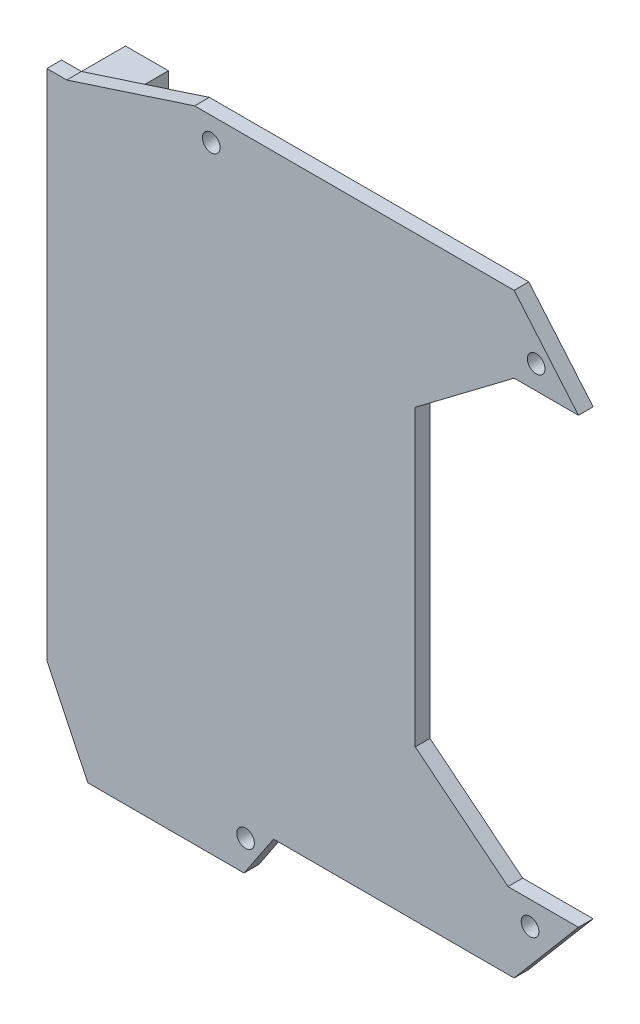
ISO-10303-21;
HEADER;
FILE_DESCRIPTION(('STEP AP214'),'2;1');
FILE_NAME('part.step','',(''),(''),'','','');
FILE_SCHEMA(('AUTOMOTIVE_DESIGN { 1 0 10303 214 1 1 1 1 }'));
ENDSEC;
DATA;
#1=APPLICATION_CONTEXT('core data for automotive mechanical design processes');
#2=APPLICATION_PROTOCOL_DEFINITION('international standard','automotive_design',2000,#1);
#3=PRODUCT_CONTEXT('',#1,'mechanical');
#4=PRODUCT('Part','Part','',(#3));
#5=PRODUCT_RELATED_PRODUCT_CATEGORY('part','',(#4));
#6=PRODUCT_DEFINITION_FORMATION('','',#4);
#7=PRODUCT_DEFINITION_CONTEXT('part definition',#1,'design');
#8=PRODUCT_DEFINITION('design','',#6,#7);
#9=PRODUCT_DEFINITION_SHAPE('','',#8);
#10=(LENGTH_UNIT() NAMED_UNIT(*) SI_UNIT(.MILLI.,.METRE.));
#11=(NAMED_UNIT(*) PLANE_ANGLE_UNIT() SI_UNIT($,.RADIAN.));
#12=(NAMED_UNIT(*) SI_UNIT($,.STERADIAN.) SOLID_ANGLE_UNIT());
#13=UNCERTAINTY_MEASURE_WITH_UNIT(LENGTH_MEASURE(1.E-05),#10,'distance_accuracy_value','');
#14=(GEOMETRIC_REPRESENTATION_CONTEXT(3) GLOBAL_UNCERTAINTY_ASSIGNED_CONTEXT((#13)) GLOBAL_UNIT_ASSIGNED_CONTEXT((#10,
#11,#12)) REPRESENTATION_CONTEXT('',''));
#15=CARTESIAN_POINT('',(0.,0.,0.));
#16=DIRECTION('',(0.,0.,1.));
#17=DIRECTION('',(1.,0.,0.));
#18=AXIS2_PLACEMENT_3D('',#15,#16,#17);
#19=CARTESIAN_POINT('',(0.,0.,0.));
#20=DIRECTION('',(0.,0.,1.));
#21=DIRECTION('',(1.,0.,0.));
#22=AXIS2_PLACEMENT_3D('',#19,#20,#21);
#23=PLANE('',#22);
#24=DIRECTION('',(1.,0.,0.));
#25=VECTOR('',#24,1.);
#26=CARTESIAN_POINT('',(3.09545141255474E-12,64.9999999999908,0.));
#27=LINE('',#26,#25);
#28=CARTESIAN_POINT('',(-165.299999999978,64.9999999999984,0.));
#29=VERTEX_POINT('',#28);
#30=CARTESIAN_POINT('',(-159.471717964454,64.9999999999984,0.));
#31=VERTEX_POINT('',#30);
#32=EDGE_CURVE('E218',#29,#31,#27,.T.);
#33=ORIENTED_EDGE('',*,*,#32,.F.);
#34=DIRECTION('',(-0.951114376083628,-0.308838863498509,0.));
#35=VECTOR('',#34,1.);
#36=CARTESIAN_POINT('',(-34.8597230210824,107.355607179939,0.));
#37=LINE('',#36,#35);
#38=CARTESIAN_POINT('',(-147.899999999978,70.65,0.));
#39=VERTEX_POINT('',#38);
#40=EDGE_CURVE('E310',#39,#29,#37,.T.);
#41=ORIENTED_EDGE('',*,*,#40,.F.);
#42=DIRECTION('',(-1.,0.,0.));
#43=VECTOR('',#42,1.);
#44=CARTESIAN_POINT('',(0.,70.65,0.));
#45=LINE('',#44,#43);
#46=CARTESIAN_POINT('',(-104.449999999978,70.65,0.));
#47=VERTEX_POINT('',#46);
#48=EDGE_CURVE('E308',#47,#39,#45,.T.);
#49=ORIENTED_EDGE('',*,*,#48,.F.);
#50=DIRECTION('',(-0.645611424246067,0.763666084675079,0.));
#51=VECTOR('',#50,1.);
#52=CARTESIAN_POINT('',(-26.0810871869541,-22.0492282982811,0.));
#53=LINE('',#52,#51);
#54=CARTESIAN_POINT('',(-95.6999999999259,60.3,0.));
#55=VERTEX_POINT('',#54);
#56=EDGE_CURVE('E306',#55,#47,#53,.T.);
#57=ORIENTED_EDGE('',*,*,#56,.F.);
#58=DIRECTION('',(1.,0.,0.));
#59=VECTOR('',#58,1.);
#60=CARTESIAN_POINT('',(0.,60.3000000000001,0.));
#61=LINE('',#60,#59);
#62=CARTESIAN_POINT('',(-104.449999999978,60.2999999999999,0.));
#63=VERTEX_POINT('',#62);
#64=EDGE_CURVE('E304',#63,#55,#61,.T.);
#65=ORIENTED_EDGE('',*,*,#64,.F.);
#66=DIRECTION('',(-0.798128725131587,-0.602486960954201,0.));
#67=VECTOR('',#66,1.);
#68=CARTESIAN_POINT('',(-66.9103493549113,88.6377221245856,0.));
#69=LINE('',#68,#67);
#70=CARTESIAN_POINT('',(-117.895945032972,50.15,0.));
#71=VERTEX_POINT('',#70);
#72=EDGE_CURVE('E254',#63,#71,#69,.T.);
#73=ORIENTED_EDGE('',*,*,#72,.T.);
#74=DIRECTION('',(0.,1.,0.));
#75=VECTOR('',#74,1.);
#76=CARTESIAN_POINT('',(-117.895945032972,0.,0.));
#77=LINE('',#76,#75);
#78=CARTESIAN_POINT('',(-117.895945032972,10.15,0.));
#79=VERTEX_POINT('',#78);
#80=EDGE_CURVE('E333',#79,#71,#77,.T.);
#81=ORIENTED_EDGE('',*,*,#80,.F.);
#82=DIRECTION('',(0.779012340572827,-0.627008591037831,0.));
#83=VECTOR('',#82,1.);
#84=CARTESIAN_POINT('',(-41.3918436804715,-51.4263400646183,0.));
#85=LINE('',#84,#83);
#86=CARTESIAN_POINT('',(-105.28531198929,0.,0.));
#87=VERTEX_POINT('',#86);
#88=EDGE_CURVE('E330',#79,#87,#85,.T.);
#89=ORIENTED_EDGE('',*,*,#88,.T.);
#90=DIRECTION('',(-1.,0.,0.));
#91=VECTOR('',#90,1.);
#92=CARTESIAN_POINT('',(0.,3.44548704045019E-12,0.));
#93=LINE('',#92,#91);
#94=CARTESIAN_POINT('',(-95.6999999999782,3.19189119579733E-13,0.));
#95=VERTEX_POINT('',#94);
#96=EDGE_CURVE('E327',#95,#87,#93,.T.);
#97=ORIENTED_EDGE('',*,*,#96,.F.);
#98=DIRECTION('',(0.645611424243821,0.763666084676978,0.));
#99=VECTOR('',#98,1.);
#100=CARTESIAN_POINT('',(-55.8108895663648,47.1831191986174,0.));
#101=LINE('',#100,#99);
#102=CARTESIAN_POINT('',(-104.449999999978,-10.35,0.));
#103=VERTEX_POINT('',#102);
#104=EDGE_CURVE('E325',#103,#95,#101,.T.);
#105=ORIENTED_EDGE('',*,*,#104,.F.);
#106=DIRECTION('',(1.,0.,0.));
#107=VECTOR('',#106,1.);
#108=CARTESIAN_POINT('',(0.,-10.35,0.));
#109=LINE('',#108,#107);
#110=CARTESIAN_POINT('',(-137.174369577049,-10.35,0.));
#111=VERTEX_POINT('',#110);
#112=EDGE_CURVE('E323',#111,#103,#109,.T.);
#113=ORIENTED_EDGE('',*,*,#112,.F.);
#114=DIRECTION('',(0.554700196225229,0.832050294337843,0.));
#115=VECTOR('',#114,1.);
#116=CARTESIAN_POINT('',(-90.189948168726,60.126632112484,0.));
#117=LINE('',#116,#115);
#118=CARTESIAN_POINT('',(-141.174369577049,-16.35,0.));
#119=VERTEX_POINT('',#118);
#120=EDGE_CURVE('E321',#119,#111,#117,.T.);
#121=ORIENTED_EDGE('',*,*,#120,.F.);
#122=DIRECTION('',(1.,0.,0.));
#123=VECTOR('',#122,1.);
#124=CARTESIAN_POINT('',(0.,-16.35,0.));
#125=LINE('',#124,#123);
#126=CARTESIAN_POINT('',(-162.432743362809,-16.35,0.));
#127=VERTEX_POINT('',#126);
#128=EDGE_CURVE('E319',#127,#119,#125,.T.);
#129=ORIENTED_EDGE('',*,*,#128,.F.);
#130=DIRECTION('',(0.43117294116868,-0.902269302815933,0.));
#131=VECTOR('',#130,1.);
#132=CARTESIAN_POINT('',(-138.595562639446,-66.2315078100012,0.));
#133=LINE('',#132,#131);
#134=CARTESIAN_POINT('',(-167.999999999978,-4.69999999999982,0.));
#135=VERTEX_POINT('',#134);
#136=EDGE_CURVE('E317',#135,#127,#133,.T.);
#137=ORIENTED_EDGE('',*,*,#136,.F.);
#138=DIRECTION('',(0.,-1.,0.));
#139=VECTOR('',#138,1.);
#140=CARTESIAN_POINT('',(-167.999999999978,-1.00350144263095E-12,0.));
#141=LINE('',#140,#139);
#142=CARTESIAN_POINT('',(-167.999999999978,64.9999999999984,0.));
#143=VERTEX_POINT('',#142);
#144=EDGE_CURVE('E315',#143,#135,#141,.T.);
#145=ORIENTED_EDGE('',*,*,#144,.F.);
#146=DIRECTION('',(1.,0.,0.));
#147=VECTOR('',#146,1.);
#148=CARTESIAN_POINT('',(0.,64.9999999999984,0.));
#149=LINE('',#148,#147);
#150=EDGE_CURVE('E313',#143,#29,#149,.T.);
#151=ORIENTED_EDGE('',*,*,#150,.T.);
#152=DIRECTION('',(0.,-1.,0.));
#153=VECTOR('',#152,1.);
#154=CARTESIAN_POINT('',(-165.299999999978,-7.63278329429795E-13,0.));
#155=LINE('',#154,#153);
#156=CARTESIAN_POINT('',(-165.299999999978,59.0000000000005,0.));
#157=VERTEX_POINT('',#156);
#158=EDGE_CURVE('E64',#29,#157,#155,.T.);
#159=ORIENTED_EDGE('',*,*,#158,.T.);
#160=DIRECTION('',(1.,0.,0.));
#161=VECTOR('',#160,1.);
#162=CARTESIAN_POINT('',(1.99005308759714E-13,59.,0.));
#163=LINE('',#162,#161);
#164=CARTESIAN_POINT('',(-159.471717964454,59.0000000000005,0.));
#165=VERTEX_POINT('',#164);
#166=EDGE_CURVE('E241',#157,#165,#163,.T.);
#167=ORIENTED_EDGE('',*,*,#166,.T.);
#168=DIRECTION('',(0.,-1.,0.));
#169=VECTOR('',#168,1.);
#170=CARTESIAN_POINT('',(-159.471717964454,0.,0.));
#171=LINE('',#170,#169);
#172=EDGE_CURVE('E221',#31,#165,#171,.T.);
#173=ORIENTED_EDGE('',*,*,#172,.F.);
#174=EDGE_LOOP('',(#33,#41,#49,#57,#65,#73,#81,#89,#97,#105,#113,#121,#129,#137,#145,#151,#159,
#167,#173));
#175=FACE_BOUND('',#174,.T.);
#176=CARTESIAN_POINT('',(-140.974369577049,-12.15,0.));
#177=DIRECTION('',(0.,0.,1.));
#178=DIRECTION('',(1.,0.,0.));
#179=AXIS2_PLACEMENT_3D('',#176,#177,#178);
#180=CIRCLE('',#179,1.19999999999996);
#181=CARTESIAN_POINT('',(-139.774369577049,-12.15,0.));
#182=VERTEX_POINT('',#181);
#183=EDGE_CURVE('E336',#182,#182,#180,.T.);
#184=ORIENTED_EDGE('',*,*,#183,.T.);
#185=EDGE_LOOP('',(#184));
#186=FACE_BOUND('',#185,.T.);
#187=CARTESIAN_POINT('',(-102.28531198929,-3.20000000000016,0.));
#188=DIRECTION('',(0.,0.,1.));
#189=DIRECTION('',(1.,0.,0.));
#190=AXIS2_PLACEMENT_3D('',#187,#188,#189);
#191=CIRCLE('',#190,1.19999999999837);
#192=CARTESIAN_POINT('',(-101.085311989291,-3.20000000000016,0.));
#193=VERTEX_POINT('',#192);
#194=EDGE_CURVE('E339',#193,#193,#191,.T.);
#195=ORIENTED_EDGE('',*,*,#194,.T.);
#196=EDGE_LOOP('',(#195));
#197=FACE_BOUND('',#196,.T.);
#198=CARTESIAN_POINT('',(-101.449999999978,63.5,0.));
#199=DIRECTION('',(0.,0.,1.));
#200=DIRECTION('',(1.,0.,0.));
#201=AXIS2_PLACEMENT_3D('',#198,#199,#200);
#202=CIRCLE('',#201,1.2);
#203=CARTESIAN_POINT('',(-100.249999999978,63.5,0.));
#204=VERTEX_POINT('',#203);
#205=EDGE_CURVE('E342',#204,#204,#202,.T.);
#206=ORIENTED_EDGE('',*,*,#205,.T.);
#207=EDGE_LOOP('',(#206));
#208=FACE_BOUND('',#207,.T.);
#209=CARTESIAN_POINT('',(-145.642132300022,67.45,0.));
#210=DIRECTION('',(0.,0.,1.));
#211=DIRECTION('',(1.,0.,0.));
#212=AXIS2_PLACEMENT_3D('',#209,#210,#211);
#213=CIRCLE('',#212,1.20000000000002);
#214=CARTESIAN_POINT('',(-144.442132300022,67.45,0.));
#215=VERTEX_POINT('',#214);
#216=EDGE_CURVE('E259',#215,#215,#213,.T.);
#217=ORIENTED_EDGE('',*,*,#216,.T.);
#218=EDGE_LOOP('',(#217));
#219=FACE_BOUND('',#218,.T.);
#220=DIRECTION('',(1.,0.,0.));
#221=VECTOR('',#220,1.);
#222=CARTESIAN_POINT('',(0.,1.30000000000023,-1.346145417358E-12));
#223=LINE('',#222,#221);
#224=CARTESIAN_POINT('',(-165.299999999978,1.30000000000052,0.));
#225=VERTEX_POINT('',#224);
#226=CARTESIAN_POINT('',(-159.471717964454,1.30000000000051,0.));
#227=VERTEX_POINT('',#226);
#228=EDGE_CURVE('E216',#225,#227,#223,.T.);
#229=ORIENTED_EDGE('',*,*,#228,.F.);
#230=DIRECTION('',(0.,-1.,0.));
#231=VECTOR('',#230,1.);
#232=CARTESIAN_POINT('',(-165.299999999978,-2.29677388219329E-12,1.346145417358E-12));
#233=LINE('',#232,#231);
#234=CARTESIAN_POINT('',(-165.299999999978,-4.69999999999948,0.));
#235=VERTEX_POINT('',#234);
#236=EDGE_CURVE('E212',#225,#235,#233,.T.);
#237=ORIENTED_EDGE('',*,*,#236,.T.);
#238=DIRECTION('',(1.,0.,0.));
#239=VECTOR('',#238,1.);
#240=CARTESIAN_POINT('',(-2.1822279226702E-13,-4.70000000000714,-1.346145417358E-12));
#241=LINE('',#240,#239);
#242=CARTESIAN_POINT('',(-159.471717964454,-4.69999999999973,0.));
#243=VERTEX_POINT('',#242);
#244=EDGE_CURVE('E56',#235,#243,#241,.T.);
#245=ORIENTED_EDGE('',*,*,#244,.T.);
#246=DIRECTION('',(0.,-1.,0.));
#247=VECTOR('',#246,1.);
#248=CARTESIAN_POINT('',(-159.471717964454,0.,1.346145417358E-12));
#249=LINE('',#248,#247);
#250=EDGE_CURVE('E860',#227,#243,#249,.T.);
#251=ORIENTED_EDGE('',*,*,#250,.F.);
#252=EDGE_LOOP('',(#229,#237,#245,#251));
#253=FACE_BOUND('',#252,.T.);
#254=ADVANCED_FACE('F41',(#175,#186,#197,#208,#219,#253),#23,.F.);
#255=CARTESIAN_POINT('',(-66.9103493549113,88.6377221245856,2.));
#256=DIRECTION('',(0.602486960954201,-0.798128725131587,0.));
#257=DIRECTION('',(0.798128725131587,0.602486960954201,0.));
#258=AXIS2_PLACEMENT_3D('',#255,#256,#257);
#259=PLANE('',#258);
#260=ORIENTED_EDGE('',*,*,#72,.F.);
#261=DIRECTION('',(0.,0.,-1.));
#262=VECTOR('',#261,1.);
#263=CARTESIAN_POINT('',(-104.449999999978,60.2999999999999,2.));
#264=LINE('',#263,#262);
#265=CARTESIAN_POINT('',(-104.449999999978,60.2999999999999,2.));
#266=VERTEX_POINT('',#265);
#267=EDGE_CURVE('E11',#266,#63,#264,.T.);
#268=ORIENTED_EDGE('',*,*,#267,.F.);
#269=DIRECTION('',(-0.798128725131587,-0.602486960954201,0.));
#270=VECTOR('',#269,1.);
#271=CARTESIAN_POINT('',(-66.9103493549113,88.6377221245856,2.));
#272=LINE('',#271,#270);
#273=CARTESIAN_POINT('',(-117.895945032972,50.15,2.));
#274=VERTEX_POINT('',#273);
#275=EDGE_CURVE('E255',#266,#274,#272,.T.);
#276=ORIENTED_EDGE('',*,*,#275,.T.);
#277=DIRECTION('',(0.,0.,-1.));
#278=VECTOR('',#277,1.);
#279=CARTESIAN_POINT('',(-117.895945032972,50.15,2.));
#280=LINE('',#279,#278);
#281=EDGE_CURVE('E301',#274,#71,#280,.T.);
#282=ORIENTED_EDGE('',*,*,#281,.T.);
#283=EDGE_LOOP('',(#260,#268,#276,#282));
#284=FACE_BOUND('',#283,.T.);
#285=ADVANCED_FACE('F43',(#284),#259,.T.);
#286=CARTESIAN_POINT('',(0.,60.3000000000001,2.));
#287=DIRECTION('',(0.,1.,0.));
#288=DIRECTION('',(-1.,0.,0.));
#289=AXIS2_PLACEMENT_3D('',#286,#287,#288);
#290=PLANE('',#289);
#291=ORIENTED_EDGE('',*,*,#64,.T.);
#292=DIRECTION('',(0.,0.,-1.));
#293=VECTOR('',#292,1.);
#294=CARTESIAN_POINT('',(-95.6999999999259,60.3,2.));
#295=LINE('',#294,#293);
#296=CARTESIAN_POINT('',(-95.6999999999259,60.3,2.));
#297=VERTEX_POINT('',#296);
#298=EDGE_CURVE('E49',#297,#55,#295,.T.);
#299=ORIENTED_EDGE('',*,*,#298,.F.);
#300=DIRECTION('',(1.,0.,0.));
#301=VECTOR('',#300,1.);
#302=CARTESIAN_POINT('',(0.,60.3000000000001,2.));
#303=LINE('',#302,#301);
#304=EDGE_CURVE('E258',#266,#297,#303,.T.);
#305=ORIENTED_EDGE('',*,*,#304,.F.);
#306=ORIENTED_EDGE('',*,*,#267,.T.);
#307=EDGE_LOOP('',(#291,#299,#305,#306));
#308=FACE_BOUND('',#307,.T.);
#309=ADVANCED_FACE('F407',(#308),#290,.F.);
#310=CARTESIAN_POINT('',(-26.0810871869541,-22.0492282982811,2.));
#311=DIRECTION('',(-0.763666084675079,-0.645611424246067,0.));
#312=DIRECTION('',(0.645611424246067,-0.763666084675079,0.));
#313=AXIS2_PLACEMENT_3D('',#310,#311,#312);
#314=PLANE('',#313);
#315=ORIENTED_EDGE('',*,*,#56,.T.);
#316=DIRECTION('',(0.,0.,-1.));
#317=VECTOR('',#316,1.);
#318=CARTESIAN_POINT('',(-104.449999999978,70.65,2.));
#319=LINE('',#318,#317);
#320=CARTESIAN_POINT('',(-104.449999999978,70.65,2.));
#321=VERTEX_POINT('',#320);
#322=EDGE_CURVE('E378',#321,#47,#319,.T.);
#323=ORIENTED_EDGE('',*,*,#322,.F.);
#324=DIRECTION('',(-0.645611424246067,0.763666084675079,0.));
#325=VECTOR('',#324,1.);
#326=CARTESIAN_POINT('',(-26.0810871869541,-22.0492282982811,2.));
#327=LINE('',#326,#325);
#328=EDGE_CURVE('E261',#297,#321,#327,.T.);
#329=ORIENTED_EDGE('',*,*,#328,.F.);
#330=ORIENTED_EDGE('',*,*,#298,.T.);
#331=EDGE_LOOP('',(#315,#323,#329,#330));
#332=FACE_BOUND('',#331,.T.);
#333=ADVANCED_FACE('F385',(#332),#314,.F.);
#334=CARTESIAN_POINT('',(0.,70.65,2.));
#335=DIRECTION('',(0.,-1.,0.));
#336=DIRECTION('',(0.,0.,-1.));
#337=AXIS2_PLACEMENT_3D('',#334,#335,#336);
#338=PLANE('',#337);
#339=ORIENTED_EDGE('',*,*,#48,.T.);
#340=DIRECTION('',(0.,0.,-1.));
#341=VECTOR('',#340,1.);
#342=CARTESIAN_POINT('',(-147.899999999978,70.65,2.));
#343=LINE('',#342,#341);
#344=CARTESIAN_POINT('',(-147.899999999978,70.65,2.));
#345=VERTEX_POINT('',#344);
#346=EDGE_CURVE('E375',#345,#39,#343,.T.);
#347=ORIENTED_EDGE('',*,*,#346,.F.);
#348=DIRECTION('',(-1.,0.,0.));
#349=VECTOR('',#348,1.);
#350=CARTESIAN_POINT('',(0.,70.65,2.));
#351=LINE('',#350,#349);
#352=EDGE_CURVE('E263',#321,#345,#351,.T.);
#353=ORIENTED_EDGE('',*,*,#352,.F.);
#354=ORIENTED_EDGE('',*,*,#322,.T.);
#355=EDGE_LOOP('',(#339,#347,#353,#354));
#356=FACE_BOUND('',#355,.T.);
#357=ADVANCED_FACE('F396',(#356),#338,.F.);
#358=CARTESIAN_POINT('',(-34.8597230210824,107.355607179939,2.));
#359=DIRECTION('',(0.308838863498509,-0.951114376083628,0.));
#360=DIRECTION('',(0.951114376083628,0.308838863498509,0.));
#361=AXIS2_PLACEMENT_3D('',#358,#359,#360);
#362=PLANE('',#361);
#363=ORIENTED_EDGE('',*,*,#40,.T.);
#364=DIRECTION('',(0.,0.,-1.));
#365=VECTOR('',#364,1.);
#366=CARTESIAN_POINT('',(-165.299999999978,64.9999999999984,2.));
#367=LINE('',#366,#365);
#368=CARTESIAN_POINT('',(-165.299999999978,64.9999999999984,2.));
#369=VERTEX_POINT('',#368);
#370=EDGE_CURVE('E372',#369,#29,#367,.T.);
#371=ORIENTED_EDGE('',*,*,#370,.F.);
#372=DIRECTION('',(-0.951114376083628,-0.308838863498509,0.));
#373=VECTOR('',#372,1.);
#374=CARTESIAN_POINT('',(-34.8597230210824,107.355607179939,2.));
#375=LINE('',#374,#373);
#376=EDGE_CURVE('E265',#345,#369,#375,.T.);
#377=ORIENTED_EDGE('',*,*,#376,.F.);
#378=ORIENTED_EDGE('',*,*,#346,.T.);
#379=EDGE_LOOP('',(#363,#371,#377,#378));
#380=FACE_BOUND('',#379,.T.);
#381=ADVANCED_FACE('F400',(#380),#362,.F.);
#382=CARTESIAN_POINT('',(0.,64.9999999999984,2.));
#383=DIRECTION('',(0.,1.,0.));
#384=DIRECTION('',(0.,0.,1.));
#385=AXIS2_PLACEMENT_3D('',#382,#383,#384);
#386=PLANE('',#385);
#387=ORIENTED_EDGE('',*,*,#150,.F.);
#388=DIRECTION('',(0.,0.,-1.));
#389=VECTOR('',#388,1.);
#390=CARTESIAN_POINT('',(-167.999999999978,64.9999999999984,2.));
#391=LINE('',#390,#389);
#392=CARTESIAN_POINT('',(-167.999999999978,64.9999999999984,2.));
#393=VERTEX_POINT('',#392);
#394=EDGE_CURVE('E370',#393,#143,#391,.T.);
#395=ORIENTED_EDGE('',*,*,#394,.F.);
#396=DIRECTION('',(1.,0.,0.));
#397=VECTOR('',#396,1.);
#398=CARTESIAN_POINT('',(0.,64.9999999999984,2.));
#399=LINE('',#398,#397);
#400=EDGE_CURVE('E267',#393,#369,#399,.T.);
#401=ORIENTED_EDGE('',*,*,#400,.T.);
#402=ORIENTED_EDGE('',*,*,#370,.T.);
#403=EDGE_LOOP('',(#387,#395,#401,#402));
#404=FACE_BOUND('',#403,.T.);
#405=ADVANCED_FACE('F454',(#404),#386,.T.);
#406=CARTESIAN_POINT('',(-167.999999999978,-1.00350144263095E-12,2.));
#407=DIRECTION('',(1.,0.,0.));
#408=DIRECTION('',(0.,1.,0.));
#409=AXIS2_PLACEMENT_3D('',#406,#407,#408);
#410=PLANE('',#409);
#411=ORIENTED_EDGE('',*,*,#144,.T.);
#412=DIRECTION('',(0.,0.,-1.));
#413=VECTOR('',#412,1.);
#414=CARTESIAN_POINT('',(-167.999999999978,-4.69999999999982,2.));
#415=LINE('',#414,#413);
#416=CARTESIAN_POINT('',(-167.999999999978,-4.69999999999982,2.));
#417=VERTEX_POINT('',#416);
#418=EDGE_CURVE('E367',#417,#135,#415,.T.);
#419=ORIENTED_EDGE('',*,*,#418,.F.);
#420=DIRECTION('',(0.,-1.,0.));
#421=VECTOR('',#420,1.);
#422=CARTESIAN_POINT('',(-167.999999999978,-1.00350144263095E-12,2.));
#423=LINE('',#422,#421);
#424=EDGE_CURVE('E270',#393,#417,#423,.T.);
#425=ORIENTED_EDGE('',*,*,#424,.F.);
#426=ORIENTED_EDGE('',*,*,#394,.T.);
#427=EDGE_LOOP('',(#411,#419,#425,#426));
#428=FACE_BOUND('',#427,.T.);
#429=ADVANCED_FACE('F451',(#428),#410,.F.);
#430=CARTESIAN_POINT('',(-138.595562639446,-66.2315078100012,2.));
#431=DIRECTION('',(0.902269302815933,0.43117294116868,0.));
#432=DIRECTION('',(-0.43117294116868,0.902269302815933,0.));
#433=AXIS2_PLACEMENT_3D('',#430,#431,#432);
#434=PLANE('',#433);
#435=ORIENTED_EDGE('',*,*,#136,.T.);
#436=DIRECTION('',(0.,0.,-1.));
#437=VECTOR('',#436,1.);
#438=CARTESIAN_POINT('',(-162.432743362809,-16.35,2.));
#439=LINE('',#438,#437);
#440=CARTESIAN_POINT('',(-162.432743362809,-16.35,2.));
#441=VERTEX_POINT('',#440);
#442=EDGE_CURVE('E364',#441,#127,#439,.T.);
#443=ORIENTED_EDGE('',*,*,#442,.F.);
#444=DIRECTION('',(0.43117294116868,-0.902269302815933,0.));
#445=VECTOR('',#444,1.);
#446=CARTESIAN_POINT('',(-138.595562639446,-66.2315078100012,2.));
#447=LINE('',#446,#445);
#448=EDGE_CURVE('E272',#417,#441,#447,.T.);
#449=ORIENTED_EDGE('',*,*,#448,.F.);
#450=ORIENTED_EDGE('',*,*,#418,.T.);
#451=EDGE_LOOP('',(#435,#443,#449,#450));
#452=FACE_BOUND('',#451,.T.);
#453=ADVANCED_FACE('F447',(#452),#434,.F.);
#454=CARTESIAN_POINT('',(0.,-16.35,2.));
#455=DIRECTION('',(0.,1.,0.));
#456=DIRECTION('',(0.,0.,1.));
#457=AXIS2_PLACEMENT_3D('',#454,#455,#456);
#458=PLANE('',#457);
#459=ORIENTED_EDGE('',*,*,#128,.T.);
#460=DIRECTION('',(0.,0.,-1.));
#461=VECTOR('',#460,1.);
#462=CARTESIAN_POINT('',(-141.174369577049,-16.35,2.));
#463=LINE('',#462,#461);
#464=CARTESIAN_POINT('',(-141.174369577049,-16.35,2.));
#465=VERTEX_POINT('',#464);
#466=EDGE_CURVE('E361',#465,#119,#463,.T.);
#467=ORIENTED_EDGE('',*,*,#466,.F.);
#468=DIRECTION('',(1.,0.,0.));
#469=VECTOR('',#468,1.);
#470=CARTESIAN_POINT('',(0.,-16.35,2.));
#471=LINE('',#470,#469);
#472=EDGE_CURVE('E274',#441,#465,#471,.T.);
#473=ORIENTED_EDGE('',*,*,#472,.F.);
#474=ORIENTED_EDGE('',*,*,#442,.T.);
#475=EDGE_LOOP('',(#459,#467,#473,#474));
#476=FACE_BOUND('',#475,.T.);
#477=ADVANCED_FACE('F442',(#476),#458,.F.);
#478=CARTESIAN_POINT('',(-90.189948168726,60.126632112484,2.));
#479=DIRECTION('',(-0.832050294337843,0.554700196225229,0.));
#480=DIRECTION('',(-0.554700196225229,-0.832050294337843,0.));
#481=AXIS2_PLACEMENT_3D('',#478,#479,#480);
#482=PLANE('',#481);
#483=ORIENTED_EDGE('',*,*,#120,.T.);
#484=DIRECTION('',(0.,0.,-1.));
#485=VECTOR('',#484,1.);
#486=CARTESIAN_POINT('',(-137.174369577049,-10.35,2.));
#487=LINE('',#486,#485);
#488=CARTESIAN_POINT('',(-137.174369577049,-10.35,2.));
#489=VERTEX_POINT('',#488);
#490=EDGE_CURVE('E358',#489,#111,#487,.T.);
#491=ORIENTED_EDGE('',*,*,#490,.F.);
#492=DIRECTION('',(0.554700196225229,0.832050294337843,0.));
#493=VECTOR('',#492,1.);
#494=CARTESIAN_POINT('',(-90.189948168726,60.126632112484,2.));
#495=LINE('',#494,#493);
#496=EDGE_CURVE('E276',#465,#489,#495,.T.);
#497=ORIENTED_EDGE('',*,*,#496,.F.);
#498=ORIENTED_EDGE('',*,*,#466,.T.);
#499=EDGE_LOOP('',(#483,#491,#497,#498));
#500=FACE_BOUND('',#499,.T.);
#501=ADVANCED_FACE('F436',(#500),#482,.F.);
#502=CARTESIAN_POINT('',(0.,-10.35,2.));
#503=DIRECTION('',(0.,1.,0.));
#504=DIRECTION('',(-1.,0.,0.));
#505=AXIS2_PLACEMENT_3D('',#502,#503,#504);
#506=PLANE('',#505);
#507=ORIENTED_EDGE('',*,*,#112,.T.);
#508=DIRECTION('',(0.,0.,-1.));
#509=VECTOR('',#508,1.);
#510=CARTESIAN_POINT('',(-104.449999999978,-10.35,2.));
#511=LINE('',#510,#509);
#512=CARTESIAN_POINT('',(-104.449999999978,-10.35,2.));
#513=VERTEX_POINT('',#512);
#514=EDGE_CURVE('E355',#513,#103,#511,.T.);
#515=ORIENTED_EDGE('',*,*,#514,.F.);
#516=DIRECTION('',(1.,0.,0.));
#517=VECTOR('',#516,1.);
#518=CARTESIAN_POINT('',(0.,-10.35,2.));
#519=LINE('',#518,#517);
#520=EDGE_CURVE('E278',#489,#513,#519,.T.);
#521=ORIENTED_EDGE('',*,*,#520,.F.);
#522=ORIENTED_EDGE('',*,*,#490,.T.);
#523=EDGE_LOOP('',(#507,#515,#521,#522));
#524=FACE_BOUND('',#523,.T.);
#525=ADVANCED_FACE('F432',(#524),#506,.F.);
#526=CARTESIAN_POINT('',(-55.8108895663648,47.1831191986174,2.));
#527=DIRECTION('',(-0.763666084676978,0.645611424243821,0.));
#528=DIRECTION('',(-0.645611424243821,-0.763666084676978,0.));
#529=AXIS2_PLACEMENT_3D('',#526,#527,#528);
#530=PLANE('',#529);
#531=ORIENTED_EDGE('',*,*,#104,.T.);
#532=DIRECTION('',(0.,0.,-1.));
#533=VECTOR('',#532,1.);
#534=CARTESIAN_POINT('',(-95.6999999999782,3.19189119579733E-13,2.));
#535=LINE('',#534,#533);
#536=CARTESIAN_POINT('',(-95.6999999999782,3.19189119579733E-13,2.));
#537=VERTEX_POINT('',#536);
#538=EDGE_CURVE('E352',#537,#95,#535,.T.);
#539=ORIENTED_EDGE('',*,*,#538,.F.);
#540=DIRECTION('',(0.645611424243821,0.763666084676978,0.));
#541=VECTOR('',#540,1.);
#542=CARTESIAN_POINT('',(-55.8108895663648,47.1831191986174,2.));
#543=LINE('',#542,#541);
#544=EDGE_CURVE('E280',#513,#537,#543,.T.);
#545=ORIENTED_EDGE('',*,*,#544,.F.);
#546=ORIENTED_EDGE('',*,*,#514,.T.);
#547=EDGE_LOOP('',(#531,#539,#545,#546));
#548=FACE_BOUND('',#547,.T.);
#549=ADVANCED_FACE('F427',(#548),#530,.F.);
#550=CARTESIAN_POINT('',(0.,3.44548704045019E-12,2.));
#551=DIRECTION('',(0.,-1.,0.));
#552=DIRECTION('',(1.,0.,0.));
#553=AXIS2_PLACEMENT_3D('',#550,#551,#552);
#554=PLANE('',#553);
#555=ORIENTED_EDGE('',*,*,#96,.T.);
#556=DIRECTION('',(0.,0.,-1.));
#557=VECTOR('',#556,1.);
#558=CARTESIAN_POINT('',(-105.28531198929,0.,2.));
#559=LINE('',#558,#557);
#560=CARTESIAN_POINT('',(-105.28531198929,0.,2.));
#561=VERTEX_POINT('',#560);
#562=EDGE_CURVE('E350',#561,#87,#559,.T.);
#563=ORIENTED_EDGE('',*,*,#562,.F.);
#564=DIRECTION('',(-1.,0.,0.));
#565=VECTOR('',#564,1.);
#566=CARTESIAN_POINT('',(0.,3.44548704045019E-12,2.));
#567=LINE('',#566,#565);
#568=EDGE_CURVE('E282',#537,#561,#567,.T.);
#569=ORIENTED_EDGE('',*,*,#568,.F.);
#570=ORIENTED_EDGE('',*,*,#538,.T.);
#571=EDGE_LOOP('',(#555,#563,#569,#570));
#572=FACE_BOUND('',#571,.T.);
#573=ADVANCED_FACE('F421',(#572),#554,.F.);
#574=CARTESIAN_POINT('',(-41.3918436804715,-51.4263400646183,2.));
#575=DIRECTION('',(0.627008591037831,0.779012340572827,0.));
#576=DIRECTION('',(-0.779012340572827,0.627008591037831,0.));
#577=AXIS2_PLACEMENT_3D('',#574,#575,#576);
#578=PLANE('',#577);
#579=ORIENTED_EDGE('',*,*,#88,.F.);
#580=DIRECTION('',(0.,0.,-1.));
#581=VECTOR('',#580,1.);
#582=CARTESIAN_POINT('',(-117.895945032972,10.15,2.));
#583=LINE('',#582,#581);
#584=CARTESIAN_POINT('',(-117.895945032972,10.15,2.));
#585=VERTEX_POINT('',#584);
#586=EDGE_CURVE('E348',#585,#79,#583,.T.);
#587=ORIENTED_EDGE('',*,*,#586,.F.);
#588=DIRECTION('',(0.779012340572827,-0.627008591037831,0.));
#589=VECTOR('',#588,1.);
#590=CARTESIAN_POINT('',(-41.3918436804715,-51.4263400646183,2.));
#591=LINE('',#590,#589);
#592=EDGE_CURVE('E284',#585,#561,#591,.T.);
#593=ORIENTED_EDGE('',*,*,#592,.T.);
#594=ORIENTED_EDGE('',*,*,#562,.T.);
#595=EDGE_LOOP('',(#579,#587,#593,#594));
#596=FACE_BOUND('',#595,.T.);
#597=ADVANCED_FACE('F415',(#596),#578,.T.);
#598=CARTESIAN_POINT('',(-101.449999999978,63.5,2.));
#599=DIRECTION('',(0.,0.,-1.));
#600=DIRECTION('',(-1.,0.,0.));
#601=AXIS2_PLACEMENT_3D('',#598,#599,#600);
#602=CYLINDRICAL_SURFACE('',#601,1.2);
#603=CARTESIAN_POINT('',(-101.449999999978,63.5,2.));
#604=DIRECTION('',(0.,0.,1.));
#605=DIRECTION('',(1.,0.,0.));
#606=AXIS2_PLACEMENT_3D('',#603,#604,#605);
#607=CIRCLE('',#606,1.2);
#608=CARTESIAN_POINT('',(-100.249999999978,63.5,2.));
#609=VERTEX_POINT('',#608);
#610=EDGE_CURVE('E295',#609,#609,#607,.T.);
#611=ORIENTED_EDGE('',*,*,#610,.T.);
#612=EDGE_LOOP('',(#611));
#613=FACE_BOUND('',#612,.T.);
#614=ORIENTED_EDGE('',*,*,#205,.F.);
#615=EDGE_LOOP('',(#614));
#616=FACE_BOUND('',#615,.T.);
#617=ADVANCED_FACE('F476',(#613,#616),#602,.F.);
#618=CARTESIAN_POINT('',(-102.28531198929,-3.20000000000016,2.));
#619=DIRECTION('',(0.,0.,-1.));
#620=DIRECTION('',(-1.,0.,0.));
#621=AXIS2_PLACEMENT_3D('',#618,#619,#620);
#622=CYLINDRICAL_SURFACE('',#621,1.19999999999837);
#623=CARTESIAN_POINT('',(-102.28531198929,-3.20000000000016,2.));
#624=DIRECTION('',(0.,0.,1.));
#625=DIRECTION('',(1.,0.,0.));
#626=AXIS2_PLACEMENT_3D('',#623,#624,#625);
#627=CIRCLE('',#626,1.19999999999837);
#628=CARTESIAN_POINT('',(-101.085311989291,-3.20000000000016,2.));
#629=VERTEX_POINT('',#628);
#630=EDGE_CURVE('E292',#629,#629,#627,.T.);
#631=ORIENTED_EDGE('',*,*,#630,.T.);
#632=EDGE_LOOP('',(#631));
#633=FACE_BOUND('',#632,.T.);
#634=ORIENTED_EDGE('',*,*,#194,.F.);
#635=EDGE_LOOP('',(#634));
#636=FACE_BOUND('',#635,.T.);
#637=ADVANCED_FACE('F479',(#633,#636),#622,.F.);
#638=CARTESIAN_POINT('',(-140.974369577049,-12.15,2.));
#639=DIRECTION('',(0.,0.,-1.));
#640=DIRECTION('',(-1.,0.,0.));
#641=AXIS2_PLACEMENT_3D('',#638,#639,#640);
#642=CYLINDRICAL_SURFACE('',#641,1.19999999999996);
#643=CARTESIAN_POINT('',(-140.974369577049,-12.15,2.));
#644=DIRECTION('',(0.,0.,1.));
#645=DIRECTION('',(1.,0.,0.));
#646=AXIS2_PLACEMENT_3D('',#643,#644,#645);
#647=CIRCLE('',#646,1.19999999999996);
#648=CARTESIAN_POINT('',(-139.774369577049,-12.15,2.));
#649=VERTEX_POINT('',#648);
#650=EDGE_CURVE('E289',#649,#649,#647,.T.);
#651=ORIENTED_EDGE('',*,*,#650,.T.);
#652=EDGE_LOOP('',(#651));
#653=FACE_BOUND('',#652,.T.);
#654=ORIENTED_EDGE('',*,*,#183,.F.);
#655=EDGE_LOOP('',(#654));
#656=FACE_BOUND('',#655,.T.);
#657=ADVANCED_FACE('F483',(#653,#656),#642,.F.);
#658=CARTESIAN_POINT('',(-117.895945032972,0.,2.));
#659=DIRECTION('',(-1.,0.,0.));
#660=DIRECTION('',(0.,0.,1.));
#661=AXIS2_PLACEMENT_3D('',#658,#659,#660);
#662=PLANE('',#661);
#663=ORIENTED_EDGE('',*,*,#80,.T.);
#664=ORIENTED_EDGE('',*,*,#281,.F.);
#665=DIRECTION('',(0.,1.,0.));
#666=VECTOR('',#665,1.);
#667=CARTESIAN_POINT('',(-117.895945032972,0.,2.));
#668=LINE('',#667,#666);
#669=EDGE_CURVE('E287',#585,#274,#668,.T.);
#670=ORIENTED_EDGE('',*,*,#669,.F.);
#671=ORIENTED_EDGE('',*,*,#586,.T.);
#672=EDGE_LOOP('',(#663,#664,#670,#671));
#673=FACE_BOUND('',#672,.T.);
#674=ADVANCED_FACE('F474',(#673),#662,.F.);
#675=CARTESIAN_POINT('',(-145.642132300022,67.45,2.));
#676=DIRECTION('',(0.,0.,-1.));
#677=DIRECTION('',(-1.,0.,0.));
#678=AXIS2_PLACEMENT_3D('',#675,#676,#677);
#679=CYLINDRICAL_SURFACE('',#678,1.20000000000002);
#680=CARTESIAN_POINT('',(-145.642132300022,67.45,2.));
#681=DIRECTION('',(0.,0.,1.));
#682=DIRECTION('',(1.,0.,0.));
#683=AXIS2_PLACEMENT_3D('',#680,#681,#682);
#684=CIRCLE('',#683,1.20000000000002);
#685=CARTESIAN_POINT('',(-144.442132300022,67.45,2.));
#686=VERTEX_POINT('',#685);
#687=EDGE_CURVE('E298',#686,#686,#684,.T.);
#688=ORIENTED_EDGE('',*,*,#687,.T.);
#689=EDGE_LOOP('',(#688));
#690=FACE_BOUND('',#689,.T.);
#691=ORIENTED_EDGE('',*,*,#216,.F.);
#692=EDGE_LOOP('',(#691));
#693=FACE_BOUND('',#692,.T.);
#694=ADVANCED_FACE('F471',(#690,#693),#679,.F.);
#695=CARTESIAN_POINT('',(0.,0.,2.));
#696=DIRECTION('',(0.,0.,1.));
#697=DIRECTION('',(1.,0.,0.));
#698=AXIS2_PLACEMENT_3D('',#695,#696,#697);
#699=PLANE('',#698);
#700=ORIENTED_EDGE('',*,*,#275,.F.);
#701=ORIENTED_EDGE('',*,*,#304,.T.);
#702=ORIENTED_EDGE('',*,*,#328,.T.);
#703=ORIENTED_EDGE('',*,*,#352,.T.);
#704=ORIENTED_EDGE('',*,*,#376,.T.);
#705=ORIENTED_EDGE('',*,*,#400,.F.);
#706=ORIENTED_EDGE('',*,*,#424,.T.);
#707=ORIENTED_EDGE('',*,*,#448,.T.);
#708=ORIENTED_EDGE('',*,*,#472,.T.);
#709=ORIENTED_EDGE('',*,*,#496,.T.);
#710=ORIENTED_EDGE('',*,*,#520,.T.);
#711=ORIENTED_EDGE('',*,*,#544,.T.);
#712=ORIENTED_EDGE('',*,*,#568,.T.);
#713=ORIENTED_EDGE('',*,*,#592,.F.);
#714=ORIENTED_EDGE('',*,*,#669,.T.);
#715=EDGE_LOOP('',(#700,#701,#702,#703,#704,#705,#706,#707,#708,#709,#710,#711,#712,#713,#714));
#716=FACE_BOUND('',#715,.T.);
#717=ORIENTED_EDGE('',*,*,#650,.F.);
#718=EDGE_LOOP('',(#717));
#719=FACE_BOUND('',#718,.T.);
#720=ORIENTED_EDGE('',*,*,#630,.F.);
#721=EDGE_LOOP('',(#720));
#722=FACE_BOUND('',#721,.T.);
#723=ORIENTED_EDGE('',*,*,#610,.F.);
#724=EDGE_LOOP('',(#723));
#725=FACE_BOUND('',#724,.T.);
#726=ORIENTED_EDGE('',*,*,#687,.F.);
#727=EDGE_LOOP('',(#726));
#728=FACE_BOUND('',#727,.T.);
#729=ADVANCED_FACE('F405',(#716,#719,#722,#725,#728),#699,.T.);
#730=CARTESIAN_POINT('',(3.09545141255474E-12,64.9999999999908,-6.00000000000001));
#731=DIRECTION('',(0.,-1.,0.));
#732=DIRECTION('',(1.,0.,0.));
#733=AXIS2_PLACEMENT_3D('',#730,#731,#732);
#734=PLANE('',#733);
#735=ORIENTED_EDGE('',*,*,#32,.T.);
#736=DIRECTION('',(0.,0.,1.));
#737=VECTOR('',#736,1.);
#738=CARTESIAN_POINT('',(-159.471717964454,64.9999999999984,-6.));
#739=LINE('',#738,#737);
#740=CARTESIAN_POINT('',(-159.471717964454,64.9999999999984,-6.));
#741=VERTEX_POINT('',#740);
#742=EDGE_CURVE('E251',#741,#31,#739,.T.);
#743=ORIENTED_EDGE('',*,*,#742,.F.);
#744=DIRECTION('',(1.,0.,0.));
#745=VECTOR('',#744,1.);
#746=CARTESIAN_POINT('',(3.09545141255474E-12,64.9999999999908,-6.00000000000001));
#747=LINE('',#746,#745);
#748=CARTESIAN_POINT('',(-165.299999999978,64.9999999999984,-6.));
#749=VERTEX_POINT('',#748);
#750=EDGE_CURVE('E227',#749,#741,#747,.T.);
#751=ORIENTED_EDGE('',*,*,#750,.F.);
#752=DIRECTION('',(0.,0.,1.));
#753=VECTOR('',#752,1.);
#754=CARTESIAN_POINT('',(-165.299999999978,64.9999999999984,-6.));
#755=LINE('',#754,#753);
#756=EDGE_CURVE('E237',#749,#29,#755,.T.);
#757=ORIENTED_EDGE('',*,*,#756,.T.);
#758=EDGE_LOOP('',(#735,#743,#751,#757));
#759=FACE_BOUND('',#758,.T.);
#760=ADVANCED_FACE('F557',(#759),#734,.F.);
#761=CARTESIAN_POINT('',(-159.471717964454,0.,-5.99999999999999));
#762=DIRECTION('',(-1.,0.,0.));
#763=DIRECTION('',(0.,-1.,0.));
#764=AXIS2_PLACEMENT_3D('',#761,#762,#763);
#765=PLANE('',#764);
#766=CARTESIAN_POINT('',(-159.471717964454,61.8999999999987,-3.09999999999959));
#767=DIRECTION('',(-1.,0.,0.));
#768=DIRECTION('',(0.,-1.,0.));
#769=AXIS2_PLACEMENT_3D('',#766,#767,#768);
#770=CIRCLE('',#769,1.5);
#771=CARTESIAN_POINT('',(-159.471717964454,60.3999999999987,-3.09999999999959));
#772=VERTEX_POINT('',#771);
#773=EDGE_CURVE('E843',#772,#772,#770,.F.);
#774=ORIENTED_EDGE('',*,*,#773,.F.);
#775=EDGE_LOOP('',(#774));
#776=FACE_BOUND('',#775,.T.);
#777=ORIENTED_EDGE('',*,*,#172,.T.);
#778=DIRECTION('',(0.,0.,1.));
#779=VECTOR('',#778,1.);
#780=CARTESIAN_POINT('',(-159.471717964454,59.0000000000005,-6.));
#781=LINE('',#780,#779);
#782=CARTESIAN_POINT('',(-159.471717964454,59.0000000000005,-6.));
#783=VERTEX_POINT('',#782);
#784=EDGE_CURVE('E248',#783,#165,#781,.T.);
#785=ORIENTED_EDGE('',*,*,#784,.F.);
#786=DIRECTION('',(0.,-1.,0.));
#787=VECTOR('',#786,1.);
#788=CARTESIAN_POINT('',(-159.471717964454,0.,-5.99999999999999));
#789=LINE('',#788,#787);
#790=EDGE_CURVE('E230',#741,#783,#789,.T.);
#791=ORIENTED_EDGE('',*,*,#790,.F.);
#792=ORIENTED_EDGE('',*,*,#742,.T.);
#793=EDGE_LOOP('',(#777,#785,#791,#792));
#794=FACE_BOUND('',#793,.T.);
#795=ADVANCED_FACE('F563',(#776,#794),#765,.F.);
#796=CARTESIAN_POINT('',(1.99005308759714E-13,59.,-6.00000000000001));
#797=DIRECTION('',(0.,-1.,0.));
#798=DIRECTION('',(1.,0.,0.));
#799=AXIS2_PLACEMENT_3D('',#796,#797,#798);
#800=PLANE('',#799);
#801=ORIENTED_EDGE('',*,*,#166,.F.);
#802=DIRECTION('',(0.,0.,1.));
#803=VECTOR('',#802,1.);
#804=CARTESIAN_POINT('',(-165.299999999978,59.0000000000005,-6.));
#805=LINE('',#804,#803);
#806=CARTESIAN_POINT('',(-165.299999999978,59.0000000000005,-6.));
#807=VERTEX_POINT('',#806);
#808=EDGE_CURVE('E246',#807,#157,#805,.T.);
#809=ORIENTED_EDGE('',*,*,#808,.F.);
#810=DIRECTION('',(1.,0.,0.));
#811=VECTOR('',#810,1.);
#812=CARTESIAN_POINT('',(1.99005308759714E-13,59.,-6.00000000000001));
#813=LINE('',#812,#811);
#814=EDGE_CURVE('E232',#807,#783,#813,.T.);
#815=ORIENTED_EDGE('',*,*,#814,.T.);
#816=ORIENTED_EDGE('',*,*,#784,.T.);
#817=EDGE_LOOP('',(#801,#809,#815,#816));
#818=FACE_BOUND('',#817,.T.);
#819=ADVANCED_FACE('F571',(#818),#800,.T.);
#820=CARTESIAN_POINT('',(-165.299999999978,-7.63278329429795E-13,-5.99999999999999));
#821=DIRECTION('',(-1.,0.,0.));
#822=DIRECTION('',(0.,-1.,0.));
#823=AXIS2_PLACEMENT_3D('',#820,#821,#822);
#824=PLANE('',#823);
#825=CARTESIAN_POINT('',(-165.299999999978,61.8999999999987,-3.09999999999959));
#826=DIRECTION('',(-1.,0.,0.));
#827=DIRECTION('',(0.,-1.,0.));
#828=AXIS2_PLACEMENT_3D('',#825,#826,#827);
#829=CIRCLE('',#828,1.5);
#830=CARTESIAN_POINT('',(-165.299999999978,60.3999999999987,-3.09999999999959));
#831=VERTEX_POINT('',#830);
#832=EDGE_CURVE('E846',#831,#831,#829,.T.);
#833=ORIENTED_EDGE('',*,*,#832,.F.);
#834=EDGE_LOOP('',(#833));
#835=FACE_BOUND('',#834,.T.);
#836=ORIENTED_EDGE('',*,*,#158,.F.);
#837=ORIENTED_EDGE('',*,*,#756,.F.);
#838=DIRECTION('',(0.,-1.,0.));
#839=VECTOR('',#838,1.);
#840=CARTESIAN_POINT('',(-165.299999999978,-7.63278329429795E-13,-5.99999999999999));
#841=LINE('',#840,#839);
#842=EDGE_CURVE('E235',#749,#807,#841,.T.);
#843=ORIENTED_EDGE('',*,*,#842,.T.);
#844=ORIENTED_EDGE('',*,*,#808,.T.);
#845=EDGE_LOOP('',(#836,#837,#843,#844));
#846=FACE_BOUND('',#845,.T.);
#847=ADVANCED_FACE('F580',(#835,#846),#824,.T.);
#848=CARTESIAN_POINT('',(0.,0.,-6.));
#849=DIRECTION('',(0.,0.,-1.));
#850=DIRECTION('',(-1.,0.,0.));
#851=AXIS2_PLACEMENT_3D('',#848,#849,#850);
#852=PLANE('',#851);
#853=ORIENTED_EDGE('',*,*,#750,.T.);
#854=ORIENTED_EDGE('',*,*,#790,.T.);
#855=ORIENTED_EDGE('',*,*,#814,.F.);
#856=ORIENTED_EDGE('',*,*,#842,.F.);
#857=EDGE_LOOP('',(#853,#854,#855,#856));
#858=FACE_BOUND('',#857,.T.);
#859=ADVANCED_FACE('F588',(#858),#852,.T.);
#860=CARTESIAN_POINT('',(0.,1.30000000000023,-6.00000000000135));
#861=DIRECTION('',(0.,-1.,0.));
#862=DIRECTION('',(1.,0.,0.));
#863=AXIS2_PLACEMENT_3D('',#860,#861,#862);
#864=PLANE('',#863);
#865=ORIENTED_EDGE('',*,*,#228,.T.);
#866=DIRECTION('',(0.,0.,1.));
#867=VECTOR('',#866,1.);
#868=CARTESIAN_POINT('',(-159.471717964454,1.30000000000051,-6.));
#869=LINE('',#868,#867);
#870=CARTESIAN_POINT('',(-159.471717964454,1.30000000000051,-6.));
#871=VERTEX_POINT('',#870);
#872=EDGE_CURVE('E197',#871,#227,#869,.T.);
#873=ORIENTED_EDGE('',*,*,#872,.F.);
#874=DIRECTION('',(1.,0.,0.));
#875=VECTOR('',#874,1.);
#876=CARTESIAN_POINT('',(0.,1.30000000000023,-6.00000000000135));
#877=LINE('',#876,#875);
#878=CARTESIAN_POINT('',(-165.299999999978,1.30000000000052,-6.));
#879=VERTEX_POINT('',#878);
#880=EDGE_CURVE('E204',#879,#871,#877,.T.);
#881=ORIENTED_EDGE('',*,*,#880,.F.);
#882=DIRECTION('',(0.,0.,1.));
#883=VECTOR('',#882,1.);
#884=CARTESIAN_POINT('',(-165.299999999978,1.30000000000052,-6.));
#885=LINE('',#884,#883);
#886=EDGE_CURVE('E858',#879,#225,#885,.T.);
#887=ORIENTED_EDGE('',*,*,#886,.T.);
#888=EDGE_LOOP('',(#865,#873,#881,#887));
#889=FACE_BOUND('',#888,.T.);
#890=ADVANCED_FACE('F214',(#889),#864,.F.);
#891=CARTESIAN_POINT('',(-159.471717964454,0.,-5.99999999999865));
#892=DIRECTION('',(-1.,0.,0.));
#893=DIRECTION('',(0.,-1.,0.));
#894=AXIS2_PLACEMENT_3D('',#891,#892,#893);
#895=PLANE('',#894);
#896=CARTESIAN_POINT('',(-159.471717964454,-1.60000000000129,-3.09999999999959));
#897=DIRECTION('',(-1.,0.,0.));
#898=DIRECTION('',(0.,-1.,0.));
#899=AXIS2_PLACEMENT_3D('',#896,#897,#898);
#900=CIRCLE('',#899,1.5);
#901=CARTESIAN_POINT('',(-159.471717964454,-3.10000000000129,-3.09999999999959));
#902=VERTEX_POINT('',#901);
#903=EDGE_CURVE('E851',#902,#902,#900,.F.);
#904=ORIENTED_EDGE('',*,*,#903,.F.);
#905=EDGE_LOOP('',(#904));
#906=FACE_BOUND('',#905,.T.);
#907=ORIENTED_EDGE('',*,*,#250,.T.);
#908=DIRECTION('',(0.,0.,1.));
#909=VECTOR('',#908,1.);
#910=CARTESIAN_POINT('',(-159.471717964454,-4.69999999999973,-6.));
#911=LINE('',#910,#909);
#912=CARTESIAN_POINT('',(-159.471717964454,-4.69999999999973,-6.));
#913=VERTEX_POINT('',#912);
#914=EDGE_CURVE('E199',#913,#243,#911,.T.);
#915=ORIENTED_EDGE('',*,*,#914,.F.);
#916=DIRECTION('',(0.,-1.,0.));
#917=VECTOR('',#916,1.);
#918=CARTESIAN_POINT('',(-159.471717964454,0.,-5.99999999999865));
#919=LINE('',#918,#917);
#920=EDGE_CURVE('E192',#871,#913,#919,.T.);
#921=ORIENTED_EDGE('',*,*,#920,.F.);
#922=ORIENTED_EDGE('',*,*,#872,.T.);
#923=EDGE_LOOP('',(#907,#915,#921,#922));
#924=FACE_BOUND('',#923,.T.);
#925=ADVANCED_FACE('F195',(#906,#924),#895,.F.);
#926=CARTESIAN_POINT('',(-2.1822279226702E-13,-4.70000000000714,-6.00000000000135));
#927=DIRECTION('',(0.,-1.,0.));
#928=DIRECTION('',(1.,0.,0.));
#929=AXIS2_PLACEMENT_3D('',#926,#927,#928);
#930=PLANE('',#929);
#931=ORIENTED_EDGE('',*,*,#244,.F.);
#932=DIRECTION('',(0.,0.,1.));
#933=VECTOR('',#932,1.);
#934=CARTESIAN_POINT('',(-165.299999999978,-4.69999999999948,-6.));
#935=LINE('',#934,#933);
#936=CARTESIAN_POINT('',(-165.299999999978,-4.69999999999948,-6.));
#937=VERTEX_POINT('',#936);
#938=EDGE_CURVE('E223',#937,#235,#935,.T.);
#939=ORIENTED_EDGE('',*,*,#938,.F.);
#940=DIRECTION('',(1.,0.,0.));
#941=VECTOR('',#940,1.);
#942=CARTESIAN_POINT('',(-2.1822279226702E-13,-4.70000000000714,-6.00000000000135));
#943=LINE('',#942,#941);
#944=EDGE_CURVE('E203',#937,#913,#943,.T.);
#945=ORIENTED_EDGE('',*,*,#944,.T.);
#946=ORIENTED_EDGE('',*,*,#914,.T.);
#947=EDGE_LOOP('',(#931,#939,#945,#946));
#948=FACE_BOUND('',#947,.T.);
#949=ADVANCED_FACE('F609',(#948),#930,.T.);
#950=CARTESIAN_POINT('',(-165.299999999978,-2.29677388219329E-12,-5.99999999999865));
#951=DIRECTION('',(-1.,0.,0.));
#952=DIRECTION('',(0.,-1.,0.));
#953=AXIS2_PLACEMENT_3D('',#950,#951,#952);
#954=PLANE('',#953);
#955=CARTESIAN_POINT('',(-165.299999999978,-1.60000000000132,-3.09999999999959));
#956=DIRECTION('',(-1.,0.,0.));
#957=DIRECTION('',(0.,-1.,0.));
#958=AXIS2_PLACEMENT_3D('',#955,#956,#957);
#959=CIRCLE('',#958,1.5);
#960=CARTESIAN_POINT('',(-165.299999999978,-3.10000000000132,-3.09999999999959));
#961=VERTEX_POINT('',#960);
#962=EDGE_CURVE('E847',#961,#961,#959,.T.);
#963=ORIENTED_EDGE('',*,*,#962,.F.);
#964=EDGE_LOOP('',(#963));
#965=FACE_BOUND('',#964,.T.);
#966=ORIENTED_EDGE('',*,*,#236,.F.);
#967=ORIENTED_EDGE('',*,*,#886,.F.);
#968=DIRECTION('',(0.,-1.,0.));
#969=VECTOR('',#968,1.);
#970=CARTESIAN_POINT('',(-165.299999999978,-2.29677388219329E-12,-5.99999999999865));
#971=LINE('',#970,#969);
#972=EDGE_CURVE('E210',#879,#937,#971,.T.);
#973=ORIENTED_EDGE('',*,*,#972,.T.);
#974=ORIENTED_EDGE('',*,*,#938,.T.);
#975=EDGE_LOOP('',(#966,#967,#973,#974));
#976=FACE_BOUND('',#975,.T.);
#977=ADVANCED_FACE('F617',(#965,#976),#954,.T.);
#978=CARTESIAN_POINT('',(0.,0.,-6.));
#979=DIRECTION('',(0.,0.,-1.));
#980=DIRECTION('',(-1.,0.,0.));
#981=AXIS2_PLACEMENT_3D('',#978,#979,#980);
#982=PLANE('',#981);
#983=ORIENTED_EDGE('',*,*,#880,.T.);
#984=ORIENTED_EDGE('',*,*,#920,.T.);
#985=ORIENTED_EDGE('',*,*,#944,.F.);
#986=ORIENTED_EDGE('',*,*,#972,.F.);
#987=EDGE_LOOP('',(#983,#984,#985,#986));
#988=FACE_BOUND('',#987,.T.);
#989=ADVANCED_FACE('F208',(#988),#982,.T.);
#990=CARTESIAN_POINT('',(-155.229077277334,-1.60000000000127,-3.09999999999959));
#991=DIRECTION('',(-1.,0.,0.));
#992=DIRECTION('',(0.,-1.,0.));
#993=AXIS2_PLACEMENT_3D('',#990,#991,#992);
#994=CYLINDRICAL_SURFACE('',#993,1.5);
#995=ORIENTED_EDGE('',*,*,#903,.T.);
#996=EDGE_LOOP('',(#995));
#997=FACE_BOUND('',#996,.T.);
#998=ORIENTED_EDGE('',*,*,#962,.T.);
#999=EDGE_LOOP('',(#998));
#1000=FACE_BOUND('',#999,.T.);
#1001=ADVANCED_FACE('F630',(#997,#1000),#994,.F.);
#1002=CARTESIAN_POINT('',(-155.229077277335,61.8999999999987,-3.09999999999959));
#1003=DIRECTION('',(-1.,0.,0.));
#1004=DIRECTION('',(0.,-1.,0.));
#1005=AXIS2_PLACEMENT_3D('',#1002,#1003,#1004);
#1006=CYLINDRICAL_SURFACE('',#1005,1.5);
#1007=ORIENTED_EDGE('',*,*,#773,.T.);
#1008=EDGE_LOOP('',(#1007));
#1009=FACE_BOUND('',#1008,.T.);
#1010=ORIENTED_EDGE('',*,*,#832,.T.);
#1011=EDGE_LOOP('',(#1010));
#1012=FACE_BOUND('',#1011,.T.);
#1013=ADVANCED_FACE('F636',(#1009,#1012),#1006,.F.);
#1014=CLOSED_SHELL('',(#254,#285,#309,#333,#357,#381,#405,#429,#453,#477,#501,#525,#549,#573,
#597,#617,#637,#657,#674,#694,#729,#760,#795,#819,#847,#859,#890,#925,#949,#977,#989,#1001,#1013));
#1015=MANIFOLD_SOLID_BREP('B2',#1014);
#1016=ADVANCED_BREP_SHAPE_REPRESENTATION('',(#18,#1015),#14);
#1017=SHAPE_DEFINITION_REPRESENTATION(#9,#1016);
ENDSEC;
END-ISO-10303-21;
